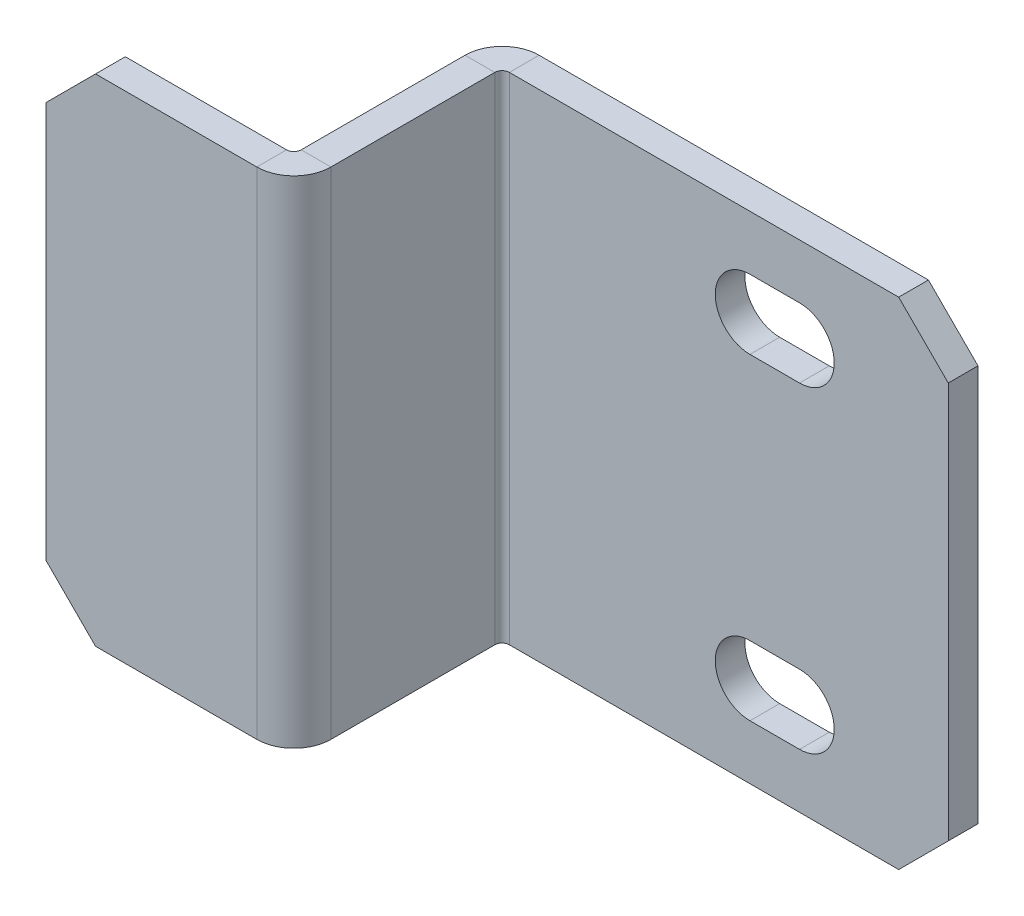
ISO-10303-21;
HEADER;
FILE_DESCRIPTION(('STEP AP214'),'2;1');
FILE_NAME('part.step','',(''),(''),'','','');
FILE_SCHEMA(('AUTOMOTIVE_DESIGN { 1 0 10303 214 1 1 1 1 }'));
ENDSEC;
DATA;
#1=APPLICATION_CONTEXT('core data for automotive mechanical design processes');
#2=APPLICATION_PROTOCOL_DEFINITION('international standard','automotive_design',2000,#1);
#3=PRODUCT_CONTEXT('',#1,'mechanical');
#4=PRODUCT('Part','Part','',(#3));
#5=PRODUCT_RELATED_PRODUCT_CATEGORY('part','',(#4));
#6=PRODUCT_DEFINITION_FORMATION('','',#4);
#7=PRODUCT_DEFINITION_CONTEXT('part definition',#1,'design');
#8=PRODUCT_DEFINITION('design','',#6,#7);
#9=PRODUCT_DEFINITION_SHAPE('','',#8);
#10=(LENGTH_UNIT() NAMED_UNIT(*) SI_UNIT(.MILLI.,.METRE.));
#11=(NAMED_UNIT(*) PLANE_ANGLE_UNIT() SI_UNIT($,.RADIAN.));
#12=(NAMED_UNIT(*) SI_UNIT($,.STERADIAN.) SOLID_ANGLE_UNIT());
#13=UNCERTAINTY_MEASURE_WITH_UNIT(LENGTH_MEASURE(1.E-05),#10,'distance_accuracy_value','');
#14=(GEOMETRIC_REPRESENTATION_CONTEXT(3) GLOBAL_UNCERTAINTY_ASSIGNED_CONTEXT((#13)) GLOBAL_UNIT_ASSIGNED_CONTEXT((#10,
#11,#12)) REPRESENTATION_CONTEXT('',''));
#15=CARTESIAN_POINT('',(0.,0.,0.));
#16=DIRECTION('',(0.,0.,1.));
#17=DIRECTION('',(1.,0.,0.));
#18=AXIS2_PLACEMENT_3D('',#15,#16,#17);
#19=CARTESIAN_POINT('',(-24.,25.,0.));
#20=DIRECTION('',(0.,-1.,0.));
#21=DIRECTION('',(0.,0.,-1.));
#22=AXIS2_PLACEMENT_3D('',#19,#20,#21);
#23=PLANE('',#22);
#24=DIRECTION('',(1.,0.,0.));
#25=VECTOR('',#24,1.);
#26=CARTESIAN_POINT('',(-24.0000000000001,25.,17.2634));
#27=LINE('',#26,#25);
#28=CARTESIAN_POINT('',(-24.0000000000001,25.,17.2634));
#29=VERTEX_POINT('',#28);
#30=CARTESIAN_POINT('',(-21.0000000000001,25.,17.2634));
#31=VERTEX_POINT('',#30);
#32=EDGE_CURVE('E336',#29,#31,#27,.T.);
#33=ORIENTED_EDGE('',*,*,#32,.T.);
#34=DIRECTION('',(0.,0.,1.));
#35=VECTOR('',#34,1.);
#36=CARTESIAN_POINT('',(-21.,25.,0.));
#37=LINE('',#36,#35);
#38=CARTESIAN_POINT('',(-21.,25.,0.736599999999997));
#39=VERTEX_POINT('',#38);
#40=EDGE_CURVE('E361',#31,#39,#37,.F.);
#41=ORIENTED_EDGE('',*,*,#40,.T.);
#42=DIRECTION('',(1.,0.,0.));
#43=VECTOR('',#42,1.);
#44=CARTESIAN_POINT('',(-24.,25.,0.736599999999986));
#45=LINE('',#44,#43);
#46=CARTESIAN_POINT('',(-24.,25.,0.736599999999987));
#47=VERTEX_POINT('',#46);
#48=EDGE_CURVE('E349',#39,#47,#45,.F.);
#49=ORIENTED_EDGE('',*,*,#48,.T.);
#50=DIRECTION('',(0.,0.,-1.));
#51=VECTOR('',#50,1.);
#52=CARTESIAN_POINT('',(-24.,25.,0.));
#53=LINE('',#52,#51);
#54=EDGE_CURVE('E356',#29,#47,#53,.T.);
#55=ORIENTED_EDGE('',*,*,#54,.F.);
#56=EDGE_LOOP('',(#33,#41,#49,#55));
#57=FACE_BOUND('',#56,.T.);
#58=ADVANCED_FACE('F80',(#57),#23,.F.);
#59=CARTESIAN_POINT('',(-24.0000000000001,-25.,21.));
#60=DIRECTION('',(0.,1.,0.));
#61=DIRECTION('',(0.,0.,1.));
#62=AXIS2_PLACEMENT_3D('',#59,#60,#61);
#63=PLANE('',#62);
#64=DIRECTION('',(1.,0.,0.));
#65=VECTOR('',#64,1.);
#66=CARTESIAN_POINT('',(-24.0000000000001,-25.,17.2634));
#67=LINE('',#66,#65);
#68=CARTESIAN_POINT('',(-24.0000000000001,-25.,17.2634));
#69=VERTEX_POINT('',#68);
#70=CARTESIAN_POINT('',(-21.0000000000001,-25.,17.2634));
#71=VERTEX_POINT('',#70);
#72=EDGE_CURVE('E346',#69,#71,#67,.T.);
#73=ORIENTED_EDGE('',*,*,#72,.F.);
#74=DIRECTION('',(0.,0.,1.));
#75=VECTOR('',#74,1.);
#76=CARTESIAN_POINT('',(-24.,-25.,0.));
#77=LINE('',#76,#75);
#78=CARTESIAN_POINT('',(-24.,-25.,0.736599999999983));
#79=VERTEX_POINT('',#78);
#80=EDGE_CURVE('E352',#79,#69,#77,.T.);
#81=ORIENTED_EDGE('',*,*,#80,.F.);
#82=DIRECTION('',(1.,0.,0.));
#83=VECTOR('',#82,1.);
#84=CARTESIAN_POINT('',(-21.,-25.,0.736599999999993));
#85=LINE('',#84,#83);
#86=CARTESIAN_POINT('',(-21.,-25.,0.736599999999993));
#87=VERTEX_POINT('',#86);
#88=EDGE_CURVE('E366',#87,#79,#85,.F.);
#89=ORIENTED_EDGE('',*,*,#88,.F.);
#90=DIRECTION('',(0.,0.,-1.));
#91=VECTOR('',#90,1.);
#92=CARTESIAN_POINT('',(-21.0000000000001,-25.,21.));
#93=LINE('',#92,#91);
#94=EDGE_CURVE('E358',#87,#71,#93,.F.);
#95=ORIENTED_EDGE('',*,*,#94,.T.);
#96=EDGE_LOOP('',(#73,#81,#89,#95));
#97=FACE_BOUND('',#96,.T.);
#98=ADVANCED_FACE('F512',(#97),#63,.F.);
#99=CARTESIAN_POINT('',(-24.,0.,0.));
#100=DIRECTION('',(1.,0.,0.));
#101=DIRECTION('',(0.,0.,-1.));
#102=AXIS2_PLACEMENT_3D('',#99,#100,#101);
#103=PLANE('',#102);
#104=DIRECTION('',(0.,1.,0.));
#105=VECTOR('',#104,1.);
#106=CARTESIAN_POINT('',(-24.0000000000001,25.,17.2634));
#107=LINE('',#106,#105);
#108=EDGE_CURVE('E342',#29,#69,#107,.F.);
#109=ORIENTED_EDGE('',*,*,#108,.F.);
#110=ORIENTED_EDGE('',*,*,#54,.T.);
#111=DIRECTION('',(0.,-1.,0.));
#112=VECTOR('',#111,1.);
#113=CARTESIAN_POINT('',(-24.,25.,0.736599999999986));
#114=LINE('',#113,#112);
#115=EDGE_CURVE('E363',#79,#47,#114,.F.);
#116=ORIENTED_EDGE('',*,*,#115,.F.);
#117=ORIENTED_EDGE('',*,*,#80,.T.);
#118=EDGE_LOOP('',(#109,#110,#116,#117));
#119=FACE_BOUND('',#118,.T.);
#120=ADVANCED_FACE('F515',(#119),#103,.F.);
#121=CARTESIAN_POINT('',(-21.,0.,0.));
#122=DIRECTION('',(1.,0.,0.));
#123=DIRECTION('',(0.,0.,-1.));
#124=AXIS2_PLACEMENT_3D('',#121,#122,#123);
#125=PLANE('',#124);
#126=ORIENTED_EDGE('',*,*,#40,.F.);
#127=DIRECTION('',(0.,1.,0.));
#128=VECTOR('',#127,1.);
#129=CARTESIAN_POINT('',(-21.0000000000001,25.,17.2634));
#130=LINE('',#129,#128);
#131=EDGE_CURVE('E329',#31,#71,#130,.F.);
#132=ORIENTED_EDGE('',*,*,#131,.T.);
#133=ORIENTED_EDGE('',*,*,#94,.F.);
#134=DIRECTION('',(0.,-1.,0.));
#135=VECTOR('',#134,1.);
#136=CARTESIAN_POINT('',(-21.,25.,0.736599999999997));
#137=LINE('',#136,#135);
#138=EDGE_CURVE('E369',#39,#87,#137,.T.);
#139=ORIENTED_EDGE('',*,*,#138,.F.);
#140=EDGE_LOOP('',(#126,#132,#133,#139));
#141=FACE_BOUND('',#140,.T.);
#142=ADVANCED_FACE('F503',(#141),#125,.T.);
#143=CARTESIAN_POINT('',(24.,-25.,-3.));
#144=DIRECTION('',(0.,-1.,0.));
#145=DIRECTION('',(1.,0.,0.));
#146=AXIS2_PLACEMENT_3D('',#143,#144,#145);
#147=PLANE('',#146);
#148=DIRECTION('',(1.,0.,0.));
#149=VECTOR('',#148,1.);
#150=CARTESIAN_POINT('',(24.,-25.,-3.));
#151=LINE('',#150,#149);
#152=CARTESIAN_POINT('',(-20.2634,-25.,-3.));
#153=VERTEX_POINT('',#152);
#154=CARTESIAN_POINT('',(19.,-25.,-3.));
#155=VERTEX_POINT('',#154);
#156=EDGE_CURVE('E397',#153,#155,#151,.T.);
#157=ORIENTED_EDGE('',*,*,#156,.T.);
#158=DIRECTION('',(0.,0.,1.));
#159=VECTOR('',#158,1.);
#160=CARTESIAN_POINT('',(19.,-25.,-3.));
#161=LINE('',#160,#159);
#162=CARTESIAN_POINT('',(19.,-25.,0.));
#163=VERTEX_POINT('',#162);
#164=EDGE_CURVE('E406',#155,#163,#161,.T.);
#165=ORIENTED_EDGE('',*,*,#164,.T.);
#166=DIRECTION('',(1.,0.,0.));
#167=VECTOR('',#166,1.);
#168=CARTESIAN_POINT('',(24.,-25.,0.));
#169=LINE('',#168,#167);
#170=CARTESIAN_POINT('',(-20.2634,-25.,0.));
#171=VERTEX_POINT('',#170);
#172=EDGE_CURVE('E394',#171,#163,#169,.T.);
#173=ORIENTED_EDGE('',*,*,#172,.F.);
#174=DIRECTION('',(0.,0.,-1.));
#175=VECTOR('',#174,1.);
#176=CARTESIAN_POINT('',(-20.2634,-25.,0.));
#177=LINE('',#176,#175);
#178=EDGE_CURVE('E380',#171,#153,#177,.T.);
#179=ORIENTED_EDGE('',*,*,#178,.T.);
#180=EDGE_LOOP('',(#157,#165,#173,#179));
#181=FACE_BOUND('',#180,.T.);
#182=ADVANCED_FACE('F472',(#181),#147,.T.);
#183=CARTESIAN_POINT('',(0.,0.,-3.));
#184=DIRECTION('',(0.,0.,1.));
#185=DIRECTION('',(1.,0.,0.));
#186=AXIS2_PLACEMENT_3D('',#183,#184,#185);
#187=PLANE('',#186);
#188=DIRECTION('',(-1.,0.,0.));
#189=VECTOR('',#188,1.);
#190=CARTESIAN_POINT('',(9.,12.5,-3.));
#191=LINE('',#190,#189);
#192=CARTESIAN_POINT('',(9.,12.5,-3.));
#193=VERTEX_POINT('',#192);
#194=CARTESIAN_POINT('',(3.99999999999999,12.5,-3.));
#195=VERTEX_POINT('',#194);
#196=EDGE_CURVE('E243',#193,#195,#191,.T.);
#197=ORIENTED_EDGE('',*,*,#196,.F.);
#198=CARTESIAN_POINT('',(9.,16.,-3.));
#199=DIRECTION('',(0.,0.,-1.));
#200=DIRECTION('',(-1.,0.,0.));
#201=AXIS2_PLACEMENT_3D('',#198,#199,#200);
#202=CIRCLE('',#201,3.5);
#203=CARTESIAN_POINT('',(9.,19.5,-3.));
#204=VERTEX_POINT('',#203);
#205=EDGE_CURVE('E96',#204,#193,#202,.T.);
#206=ORIENTED_EDGE('',*,*,#205,.F.);
#207=DIRECTION('',(1.,0.,0.));
#208=VECTOR('',#207,1.);
#209=CARTESIAN_POINT('',(9.,19.5,-3.));
#210=LINE('',#209,#208);
#211=CARTESIAN_POINT('',(4.,19.5,-3.));
#212=VERTEX_POINT('',#211);
#213=EDGE_CURVE('E263',#212,#204,#210,.T.);
#214=ORIENTED_EDGE('',*,*,#213,.F.);
#215=CARTESIAN_POINT('',(3.99999999999999,16.,-3.));
#216=DIRECTION('',(0.,0.,-1.));
#217=DIRECTION('',(-1.,0.,0.));
#218=AXIS2_PLACEMENT_3D('',#215,#216,#217);
#219=CIRCLE('',#218,3.5);
#220=EDGE_CURVE('E251',#195,#212,#219,.T.);
#221=ORIENTED_EDGE('',*,*,#220,.F.);
#222=EDGE_LOOP('',(#197,#206,#214,#221));
#223=FACE_BOUND('',#222,.T.);
#224=DIRECTION('',(-1.,0.,0.));
#225=VECTOR('',#224,1.);
#226=CARTESIAN_POINT('',(9.,-19.5,-3.));
#227=LINE('',#226,#225);
#228=CARTESIAN_POINT('',(9.,-19.5,-3.));
#229=VERTEX_POINT('',#228);
#230=CARTESIAN_POINT('',(3.99999999999999,-19.5,-3.));
#231=VERTEX_POINT('',#230);
#232=EDGE_CURVE('E275',#229,#231,#227,.T.);
#233=ORIENTED_EDGE('',*,*,#232,.F.);
#234=CARTESIAN_POINT('',(9.,-16.,-3.));
#235=DIRECTION('',(0.,0.,-1.));
#236=DIRECTION('',(-1.,0.,0.));
#237=AXIS2_PLACEMENT_3D('',#234,#235,#236);
#238=CIRCLE('',#237,3.5);
#239=CARTESIAN_POINT('',(9.,-12.5,-3.));
#240=VERTEX_POINT('',#239);
#241=EDGE_CURVE('E104',#240,#229,#238,.T.);
#242=ORIENTED_EDGE('',*,*,#241,.F.);
#243=DIRECTION('',(1.,0.,0.));
#244=VECTOR('',#243,1.);
#245=CARTESIAN_POINT('',(9.,-12.5,-3.));
#246=LINE('',#245,#244);
#247=CARTESIAN_POINT('',(4.,-12.5,-3.));
#248=VERTEX_POINT('',#247);
#249=EDGE_CURVE('E280',#248,#240,#246,.T.);
#250=ORIENTED_EDGE('',*,*,#249,.F.);
#251=CARTESIAN_POINT('',(3.99999999999999,-16.,-3.));
#252=DIRECTION('',(0.,0.,-1.));
#253=DIRECTION('',(-1.,0.,0.));
#254=AXIS2_PLACEMENT_3D('',#251,#252,#253);
#255=CIRCLE('',#254,3.5);
#256=EDGE_CURVE('E277',#231,#248,#255,.T.);
#257=ORIENTED_EDGE('',*,*,#256,.F.);
#258=EDGE_LOOP('',(#233,#242,#250,#257));
#259=FACE_BOUND('',#258,.T.);
#260=DIRECTION('',(0.,1.,0.));
#261=VECTOR('',#260,1.);
#262=CARTESIAN_POINT('',(24.,-25.,-3.));
#263=LINE('',#262,#261);
#264=CARTESIAN_POINT('',(24.,-20.,-3.));
#265=VERTEX_POINT('',#264);
#266=CARTESIAN_POINT('',(24.,20.,-3.));
#267=VERTEX_POINT('',#266);
#268=EDGE_CURVE('E400',#265,#267,#263,.T.);
#269=ORIENTED_EDGE('',*,*,#268,.F.);
#270=DIRECTION('',(0.707106781186547,0.707106781186549,0.));
#271=VECTOR('',#270,1.);
#272=CARTESIAN_POINT('',(19.,-25.,-3.));
#273=LINE('',#272,#271);
#274=EDGE_CURVE('E426',#265,#155,#273,.F.);
#275=ORIENTED_EDGE('',*,*,#274,.T.);
#276=ORIENTED_EDGE('',*,*,#156,.F.);
#277=DIRECTION('',(0.,-1.,0.));
#278=VECTOR('',#277,1.);
#279=CARTESIAN_POINT('',(-20.2634,-25.,-3.));
#280=LINE('',#279,#278);
#281=CARTESIAN_POINT('',(-20.2634,25.,-3.));
#282=VERTEX_POINT('',#281);
#283=EDGE_CURVE('E373',#153,#282,#280,.F.);
#284=ORIENTED_EDGE('',*,*,#283,.T.);
#285=DIRECTION('',(-1.,0.,0.));
#286=VECTOR('',#285,1.);
#287=CARTESIAN_POINT('',(24.,25.,-3.));
#288=LINE('',#287,#286);
#289=CARTESIAN_POINT('',(19.,25.,-3.));
#290=VERTEX_POINT('',#289);
#291=EDGE_CURVE('E404',#290,#282,#288,.T.);
#292=ORIENTED_EDGE('',*,*,#291,.F.);
#293=DIRECTION('',(-0.707106781186549,0.707106781186546,0.));
#294=VECTOR('',#293,1.);
#295=CARTESIAN_POINT('',(24.,20.,-3.));
#296=LINE('',#295,#294);
#297=EDGE_CURVE('E424',#290,#267,#296,.F.);
#298=ORIENTED_EDGE('',*,*,#297,.T.);
#299=EDGE_LOOP('',(#269,#275,#276,#284,#292,#298));
#300=FACE_BOUND('',#299,.T.);
#301=ADVANCED_FACE('F260',(#223,#259,#300),#187,.F.);
#302=CARTESIAN_POINT('',(0.,0.,0.));
#303=DIRECTION('',(0.,0.,1.));
#304=DIRECTION('',(1.,0.,0.));
#305=AXIS2_PLACEMENT_3D('',#302,#303,#304);
#306=PLANE('',#305);
#307=CARTESIAN_POINT('',(9.,16.,0.));
#308=DIRECTION('',(0.,0.,1.));
#309=DIRECTION('',(1.,0.,0.));
#310=AXIS2_PLACEMENT_3D('',#307,#308,#309);
#311=CIRCLE('',#310,3.5);
#312=CARTESIAN_POINT('',(9.,12.5,0.));
#313=VERTEX_POINT('',#312);
#314=CARTESIAN_POINT('',(9.,19.5,0.));
#315=VERTEX_POINT('',#314);
#316=EDGE_CURVE('E13',#313,#315,#311,.T.);
#317=ORIENTED_EDGE('',*,*,#316,.F.);
#318=DIRECTION('',(1.,0.,0.));
#319=VECTOR('',#318,1.);
#320=CARTESIAN_POINT('',(0.,12.5,0.));
#321=LINE('',#320,#319);
#322=CARTESIAN_POINT('',(3.99999999999999,12.5,0.));
#323=VERTEX_POINT('',#322);
#324=EDGE_CURVE('E271',#323,#313,#321,.T.);
#325=ORIENTED_EDGE('',*,*,#324,.F.);
#326=CARTESIAN_POINT('',(3.99999999999999,16.,0.));
#327=DIRECTION('',(0.,0.,1.));
#328=DIRECTION('',(1.,0.,0.));
#329=AXIS2_PLACEMENT_3D('',#326,#327,#328);
#330=CIRCLE('',#329,3.5);
#331=CARTESIAN_POINT('',(4.,19.5,0.));
#332=VERTEX_POINT('',#331);
#333=EDGE_CURVE('E89',#332,#323,#330,.T.);
#334=ORIENTED_EDGE('',*,*,#333,.F.);
#335=DIRECTION('',(-1.,0.,0.));
#336=VECTOR('',#335,1.);
#337=CARTESIAN_POINT('',(0.,19.5,0.));
#338=LINE('',#337,#336);
#339=EDGE_CURVE('E294',#315,#332,#338,.T.);
#340=ORIENTED_EDGE('',*,*,#339,.F.);
#341=EDGE_LOOP('',(#317,#325,#334,#340));
#342=FACE_BOUND('',#341,.T.);
#343=CARTESIAN_POINT('',(9.,-16.,0.));
#344=DIRECTION('',(0.,0.,1.));
#345=DIRECTION('',(1.,0.,0.));
#346=AXIS2_PLACEMENT_3D('',#343,#344,#345);
#347=CIRCLE('',#346,3.5);
#348=CARTESIAN_POINT('',(9.,-19.5,0.));
#349=VERTEX_POINT('',#348);
#350=CARTESIAN_POINT('',(9.,-12.5,0.));
#351=VERTEX_POINT('',#350);
#352=EDGE_CURVE('E450',#349,#351,#347,.T.);
#353=ORIENTED_EDGE('',*,*,#352,.F.);
#354=DIRECTION('',(1.,0.,0.));
#355=VECTOR('',#354,1.);
#356=CARTESIAN_POINT('',(0.,-19.5,0.));
#357=LINE('',#356,#355);
#358=CARTESIAN_POINT('',(3.99999999999999,-19.5,0.));
#359=VERTEX_POINT('',#358);
#360=EDGE_CURVE('E296',#359,#349,#357,.T.);
#361=ORIENTED_EDGE('',*,*,#360,.F.);
#362=CARTESIAN_POINT('',(3.99999999999999,-16.,0.));
#363=DIRECTION('',(0.,0.,1.));
#364=DIRECTION('',(1.,0.,0.));
#365=AXIS2_PLACEMENT_3D('',#362,#363,#364);
#366=CIRCLE('',#365,3.5);
#367=CARTESIAN_POINT('',(4.,-12.5,0.));
#368=VERTEX_POINT('',#367);
#369=EDGE_CURVE('E448',#368,#359,#366,.T.);
#370=ORIENTED_EDGE('',*,*,#369,.F.);
#371=DIRECTION('',(-1.,0.,0.));
#372=VECTOR('',#371,1.);
#373=CARTESIAN_POINT('',(0.,-12.5,0.));
#374=LINE('',#373,#372);
#375=EDGE_CURVE('E298',#351,#368,#374,.T.);
#376=ORIENTED_EDGE('',*,*,#375,.F.);
#377=EDGE_LOOP('',(#353,#361,#370,#376));
#378=FACE_BOUND('',#377,.T.);
#379=ORIENTED_EDGE('',*,*,#172,.T.);
#380=DIRECTION('',(-0.707106781186547,-0.707106781186549,0.));
#381=VECTOR('',#380,1.);
#382=CARTESIAN_POINT('',(22.,-22.,0.));
#383=LINE('',#382,#381);
#384=CARTESIAN_POINT('',(24.,-20.,0.));
#385=VERTEX_POINT('',#384);
#386=EDGE_CURVE('E417',#163,#385,#383,.F.);
#387=ORIENTED_EDGE('',*,*,#386,.T.);
#388=DIRECTION('',(0.,1.,0.));
#389=VECTOR('',#388,1.);
#390=CARTESIAN_POINT('',(24.,-25.,0.));
#391=LINE('',#390,#389);
#392=CARTESIAN_POINT('',(24.,20.,0.));
#393=VERTEX_POINT('',#392);
#394=EDGE_CURVE('E409',#385,#393,#391,.T.);
#395=ORIENTED_EDGE('',*,*,#394,.T.);
#396=DIRECTION('',(0.707106781186549,-0.707106781186546,0.));
#397=VECTOR('',#396,1.);
#398=CARTESIAN_POINT('',(21.9999999999999,22.0000000000001,0.));
#399=LINE('',#398,#397);
#400=CARTESIAN_POINT('',(19.,25.,0.));
#401=VERTEX_POINT('',#400);
#402=EDGE_CURVE('E415',#393,#401,#399,.F.);
#403=ORIENTED_EDGE('',*,*,#402,.T.);
#404=DIRECTION('',(-1.,0.,0.));
#405=VECTOR('',#404,1.);
#406=CARTESIAN_POINT('',(24.,25.,0.));
#407=LINE('',#406,#405);
#408=CARTESIAN_POINT('',(-20.2634,25.,0.));
#409=VERTEX_POINT('',#408);
#410=EDGE_CURVE('E401',#401,#409,#407,.T.);
#411=ORIENTED_EDGE('',*,*,#410,.T.);
#412=DIRECTION('',(0.,-1.,0.));
#413=VECTOR('',#412,1.);
#414=CARTESIAN_POINT('',(-20.2634,-25.,0.));
#415=LINE('',#414,#413);
#416=EDGE_CURVE('E386',#171,#409,#415,.F.);
#417=ORIENTED_EDGE('',*,*,#416,.F.);
#418=EDGE_LOOP('',(#379,#387,#395,#403,#411,#417));
#419=FACE_BOUND('',#418,.T.);
#420=ADVANCED_FACE('F461',(#342,#378,#419),#306,.T.);
#421=CARTESIAN_POINT('',(24.,25.,-3.));
#422=DIRECTION('',(0.,1.,0.));
#423=DIRECTION('',(-1.,0.,0.));
#424=AXIS2_PLACEMENT_3D('',#421,#422,#423);
#425=PLANE('',#424);
#426=ORIENTED_EDGE('',*,*,#410,.F.);
#427=DIRECTION('',(0.,0.,-1.));
#428=VECTOR('',#427,1.);
#429=CARTESIAN_POINT('',(19.,25.,-3.));
#430=LINE('',#429,#428);
#431=EDGE_CURVE('E428',#401,#290,#430,.T.);
#432=ORIENTED_EDGE('',*,*,#431,.T.);
#433=ORIENTED_EDGE('',*,*,#291,.T.);
#434=DIRECTION('',(0.,0.,-1.));
#435=VECTOR('',#434,1.);
#436=CARTESIAN_POINT('',(-20.2634,25.,0.));
#437=LINE('',#436,#435);
#438=EDGE_CURVE('E391',#409,#282,#437,.T.);
#439=ORIENTED_EDGE('',*,*,#438,.F.);
#440=EDGE_LOOP('',(#426,#432,#433,#439));
#441=FACE_BOUND('',#440,.T.);
#442=ADVANCED_FACE('F524',(#441),#425,.T.);
#443=CARTESIAN_POINT('',(24.,-25.,-3.));
#444=DIRECTION('',(1.,0.,0.));
#445=DIRECTION('',(0.,0.,-1.));
#446=AXIS2_PLACEMENT_3D('',#443,#444,#445);
#447=PLANE('',#446);
#448=ORIENTED_EDGE('',*,*,#394,.F.);
#449=DIRECTION('',(0.,0.,-1.));
#450=VECTOR('',#449,1.);
#451=CARTESIAN_POINT('',(24.,-20.,-3.));
#452=LINE('',#451,#450);
#453=EDGE_CURVE('E422',#385,#265,#452,.T.);
#454=ORIENTED_EDGE('',*,*,#453,.T.);
#455=ORIENTED_EDGE('',*,*,#268,.T.);
#456=DIRECTION('',(0.,0.,1.));
#457=VECTOR('',#456,1.);
#458=CARTESIAN_POINT('',(24.,20.,-3.));
#459=LINE('',#458,#457);
#460=EDGE_CURVE('E419',#267,#393,#459,.T.);
#461=ORIENTED_EDGE('',*,*,#460,.T.);
#462=EDGE_LOOP('',(#448,#454,#455,#461));
#463=FACE_BOUND('',#462,.T.);
#464=ADVANCED_FACE('F523',(#463),#447,.T.);
#465=CARTESIAN_POINT('',(-20.2634,25.,0.7366));
#466=DIRECTION('',(0.,1.,0.));
#467=DIRECTION('',(0.,0.,1.));
#468=AXIS2_PLACEMENT_3D('',#465,#466,#467);
#469=PLANE('',#468);
#470=ORIENTED_EDGE('',*,*,#48,.F.);
#471=CARTESIAN_POINT('',(-20.2634,25.,0.7366));
#472=DIRECTION('',(0.,-1.,0.));
#473=DIRECTION('',(0.,0.,-1.));
#474=AXIS2_PLACEMENT_3D('',#471,#472,#473);
#475=CIRCLE('',#474,0.7366);
#476=EDGE_CURVE('E383',#409,#39,#475,.F.);
#477=ORIENTED_EDGE('',*,*,#476,.F.);
#478=ORIENTED_EDGE('',*,*,#438,.T.);
#479=CARTESIAN_POINT('',(-20.2634,25.,0.7366));
#480=DIRECTION('',(0.,-1.,0.));
#481=DIRECTION('',(0.,0.,-1.));
#482=AXIS2_PLACEMENT_3D('',#479,#480,#481);
#483=CIRCLE('',#482,3.7366);
#484=EDGE_CURVE('E376',#282,#47,#483,.F.);
#485=ORIENTED_EDGE('',*,*,#484,.T.);
#486=EDGE_LOOP('',(#470,#477,#478,#485));
#487=FACE_BOUND('',#486,.T.);
#488=ADVANCED_FACE('F497',(#487),#469,.T.);
#489=CARTESIAN_POINT('',(-20.2634,-25.,0.736599999999996));
#490=DIRECTION('',(0.,1.,0.));
#491=DIRECTION('',(0.,0.,1.));
#492=AXIS2_PLACEMENT_3D('',#489,#490,#491);
#493=PLANE('',#492);
#494=CARTESIAN_POINT('',(-20.2634,-25.,0.736599999999996));
#495=DIRECTION('',(0.,-1.,0.));
#496=DIRECTION('',(0.,0.,-1.));
#497=AXIS2_PLACEMENT_3D('',#494,#495,#496);
#498=CIRCLE('',#497,0.7366);
#499=EDGE_CURVE('E355',#87,#171,#498,.T.);
#500=ORIENTED_EDGE('',*,*,#499,.F.);
#501=ORIENTED_EDGE('',*,*,#88,.T.);
#502=CARTESIAN_POINT('',(-20.2634,-25.,0.736599999999996));
#503=DIRECTION('',(0.,-1.,0.));
#504=DIRECTION('',(0.,0.,-1.));
#505=AXIS2_PLACEMENT_3D('',#502,#503,#504);
#506=CIRCLE('',#505,3.7366);
#507=EDGE_CURVE('E377',#79,#153,#506,.T.);
#508=ORIENTED_EDGE('',*,*,#507,.T.);
#509=ORIENTED_EDGE('',*,*,#178,.F.);
#510=EDGE_LOOP('',(#500,#501,#508,#509));
#511=FACE_BOUND('',#510,.T.);
#512=ADVANCED_FACE('F507',(#511),#493,.F.);
#513=CARTESIAN_POINT('',(-20.2634,-25.,0.736599999999996));
#514=DIRECTION('',(0.,-1.,0.));
#515=DIRECTION('',(-1.,0.,0.));
#516=AXIS2_PLACEMENT_3D('',#513,#514,#515);
#517=CYLINDRICAL_SURFACE('',#516,3.7366);
#518=ORIENTED_EDGE('',*,*,#283,.F.);
#519=ORIENTED_EDGE('',*,*,#507,.F.);
#520=ORIENTED_EDGE('',*,*,#115,.T.);
#521=ORIENTED_EDGE('',*,*,#484,.F.);
#522=EDGE_LOOP('',(#518,#519,#520,#521));
#523=FACE_BOUND('',#522,.T.);
#524=ADVANCED_FACE('F518',(#523),#517,.T.);
#525=CARTESIAN_POINT('',(-20.2634,-25.,0.736599999999996));
#526=DIRECTION('',(0.,-1.,0.));
#527=DIRECTION('',(-1.,0.,0.));
#528=AXIS2_PLACEMENT_3D('',#525,#526,#527);
#529=CYLINDRICAL_SURFACE('',#528,0.7366);
#530=ORIENTED_EDGE('',*,*,#416,.T.);
#531=ORIENTED_EDGE('',*,*,#476,.T.);
#532=ORIENTED_EDGE('',*,*,#138,.T.);
#533=ORIENTED_EDGE('',*,*,#499,.T.);
#534=EDGE_LOOP('',(#530,#531,#532,#533));
#535=FACE_BOUND('',#534,.T.);
#536=ADVANCED_FACE('F492',(#535),#529,.F.);
#537=CARTESIAN_POINT('',(-24.7366000000001,-25.,17.2634));
#538=DIRECTION('',(0.,-1.,0.));
#539=DIRECTION('',(0.,0.,-1.));
#540=AXIS2_PLACEMENT_3D('',#537,#538,#539);
#541=PLANE('',#540);
#542=DIRECTION('',(0.,0.,1.));
#543=VECTOR('',#542,1.);
#544=CARTESIAN_POINT('',(-24.7366000000001,-25.,21.));
#545=LINE('',#544,#543);
#546=CARTESIAN_POINT('',(-24.7366000000001,-25.,18.));
#547=VERTEX_POINT('',#546);
#548=CARTESIAN_POINT('',(-24.7366000000001,-25.,21.));
#549=VERTEX_POINT('',#548);
#550=EDGE_CURVE('E300',#547,#549,#545,.T.);
#551=ORIENTED_EDGE('',*,*,#550,.F.);
#552=CARTESIAN_POINT('',(-24.7366000000001,-25.,17.2634));
#553=DIRECTION('',(0.,1.,0.));
#554=DIRECTION('',(0.,0.,1.));
#555=AXIS2_PLACEMENT_3D('',#552,#553,#554);
#556=CIRCLE('',#555,0.736600000000004);
#557=EDGE_CURVE('E339',#69,#547,#556,.F.);
#558=ORIENTED_EDGE('',*,*,#557,.F.);
#559=ORIENTED_EDGE('',*,*,#72,.T.);
#560=CARTESIAN_POINT('',(-24.7366000000001,-25.,17.2634));
#561=DIRECTION('',(0.,1.,0.));
#562=DIRECTION('',(0.,0.,1.));
#563=AXIS2_PLACEMENT_3D('',#560,#561,#562);
#564=CIRCLE('',#563,3.7366);
#565=EDGE_CURVE('E332',#71,#549,#564,.F.);
#566=ORIENTED_EDGE('',*,*,#565,.T.);
#567=EDGE_LOOP('',(#551,#558,#559,#566));
#568=FACE_BOUND('',#567,.T.);
#569=ADVANCED_FACE('F546',(#568),#541,.T.);
#570=CARTESIAN_POINT('',(-24.7366000000001,25.,17.2634));
#571=DIRECTION('',(0.,-1.,0.));
#572=DIRECTION('',(0.,0.,-1.));
#573=AXIS2_PLACEMENT_3D('',#570,#571,#572);
#574=PLANE('',#573);
#575=CARTESIAN_POINT('',(-24.7366000000001,25.,17.2634));
#576=DIRECTION('',(0.,1.,0.));
#577=DIRECTION('',(0.,0.,1.));
#578=AXIS2_PLACEMENT_3D('',#575,#576,#577);
#579=CIRCLE('',#578,0.736600000000004);
#580=CARTESIAN_POINT('',(-24.7366000000001,25.,18.));
#581=VERTEX_POINT('',#580);
#582=EDGE_CURVE('E303',#581,#29,#579,.T.);
#583=ORIENTED_EDGE('',*,*,#582,.F.);
#584=DIRECTION('',(0.,0.,1.));
#585=VECTOR('',#584,1.);
#586=CARTESIAN_POINT('',(-24.7366000000001,25.,18.));
#587=LINE('',#586,#585);
#588=CARTESIAN_POINT('',(-24.7366000000001,25.,21.));
#589=VERTEX_POINT('',#588);
#590=EDGE_CURVE('E321',#581,#589,#587,.T.);
#591=ORIENTED_EDGE('',*,*,#590,.T.);
#592=CARTESIAN_POINT('',(-24.7366000000001,25.,17.2634));
#593=DIRECTION('',(0.,1.,0.));
#594=DIRECTION('',(0.,0.,1.));
#595=AXIS2_PLACEMENT_3D('',#592,#593,#594);
#596=CIRCLE('',#595,3.7366);
#597=EDGE_CURVE('E333',#589,#31,#596,.T.);
#598=ORIENTED_EDGE('',*,*,#597,.T.);
#599=ORIENTED_EDGE('',*,*,#32,.F.);
#600=EDGE_LOOP('',(#583,#591,#598,#599));
#601=FACE_BOUND('',#600,.T.);
#602=ADVANCED_FACE('F568',(#601),#574,.F.);
#603=CARTESIAN_POINT('',(-24.7366000000001,25.,17.2634));
#604=DIRECTION('',(0.,1.,0.));
#605=DIRECTION('',(0.,0.,1.));
#606=AXIS2_PLACEMENT_3D('',#603,#604,#605);
#607=CYLINDRICAL_SURFACE('',#606,3.7366);
#608=ORIENTED_EDGE('',*,*,#131,.F.);
#609=ORIENTED_EDGE('',*,*,#597,.F.);
#610=DIRECTION('',(0.,1.,0.));
#611=VECTOR('',#610,1.);
#612=CARTESIAN_POINT('',(-24.7366000000001,0.,21.));
#613=LINE('',#612,#611);
#614=EDGE_CURVE('E318',#549,#589,#613,.T.);
#615=ORIENTED_EDGE('',*,*,#614,.F.);
#616=ORIENTED_EDGE('',*,*,#565,.F.);
#617=EDGE_LOOP('',(#608,#609,#615,#616));
#618=FACE_BOUND('',#617,.T.);
#619=ADVANCED_FACE('F577',(#618),#607,.T.);
#620=CARTESIAN_POINT('',(-24.7366000000001,25.,17.2634));
#621=DIRECTION('',(0.,1.,0.));
#622=DIRECTION('',(0.,0.,1.));
#623=AXIS2_PLACEMENT_3D('',#620,#621,#622);
#624=CYLINDRICAL_SURFACE('',#623,0.736600000000004);
#625=ORIENTED_EDGE('',*,*,#108,.T.);
#626=ORIENTED_EDGE('',*,*,#557,.T.);
#627=DIRECTION('',(0.,-1.,0.));
#628=VECTOR('',#627,1.);
#629=CARTESIAN_POINT('',(-24.7366000000001,-25.,18.));
#630=LINE('',#629,#628);
#631=EDGE_CURVE('E324',#547,#581,#630,.F.);
#632=ORIENTED_EDGE('',*,*,#631,.T.);
#633=ORIENTED_EDGE('',*,*,#582,.T.);
#634=EDGE_LOOP('',(#625,#626,#632,#633));
#635=FACE_BOUND('',#634,.T.);
#636=ADVANCED_FACE('F585',(#635),#624,.F.);
#637=CARTESIAN_POINT('',(-24.0000000000001,25.,21.));
#638=DIRECTION('',(0.,1.,0.));
#639=DIRECTION('',(0.,0.,1.));
#640=AXIS2_PLACEMENT_3D('',#637,#638,#639);
#641=PLANE('',#640);
#642=DIRECTION('',(-1.,0.,0.));
#643=VECTOR('',#642,1.);
#644=CARTESIAN_POINT('',(0.,25.,18.));
#645=LINE('',#644,#643);
#646=CARTESIAN_POINT('',(-41.0000000000001,25.,18.));
#647=VERTEX_POINT('',#646);
#648=EDGE_CURVE('E310',#647,#581,#645,.F.);
#649=ORIENTED_EDGE('',*,*,#648,.F.);
#650=DIRECTION('',(0.,0.,1.));
#651=VECTOR('',#650,1.);
#652=CARTESIAN_POINT('',(-41.0000000000001,25.,21.));
#653=LINE('',#652,#651);
#654=CARTESIAN_POINT('',(-41.0000000000001,25.,21.));
#655=VERTEX_POINT('',#654);
#656=EDGE_CURVE('E446',#647,#655,#653,.T.);
#657=ORIENTED_EDGE('',*,*,#656,.T.);
#658=DIRECTION('',(1.,0.,0.));
#659=VECTOR('',#658,1.);
#660=CARTESIAN_POINT('',(-24.0000000000001,25.,21.));
#661=LINE('',#660,#659);
#662=EDGE_CURVE('E301',#655,#589,#661,.T.);
#663=ORIENTED_EDGE('',*,*,#662,.T.);
#664=ORIENTED_EDGE('',*,*,#590,.F.);
#665=EDGE_LOOP('',(#649,#657,#663,#664));
#666=FACE_BOUND('',#665,.T.);
#667=ADVANCED_FACE('F593',(#666),#641,.T.);
#668=CARTESIAN_POINT('',(-46.0000000000001,-25.,21.));
#669=DIRECTION('',(0.,-1.,0.));
#670=DIRECTION('',(1.,0.,0.));
#671=AXIS2_PLACEMENT_3D('',#668,#669,#670);
#672=PLANE('',#671);
#673=DIRECTION('',(-1.,0.,0.));
#674=VECTOR('',#673,1.);
#675=CARTESIAN_POINT('',(-46.0000000000001,-25.,21.));
#676=LINE('',#675,#674);
#677=CARTESIAN_POINT('',(-41.0000000000001,-25.,21.));
#678=VERTEX_POINT('',#677);
#679=EDGE_CURVE('E307',#549,#678,#676,.T.);
#680=ORIENTED_EDGE('',*,*,#679,.T.);
#681=DIRECTION('',(0.,0.,-1.));
#682=VECTOR('',#681,1.);
#683=CARTESIAN_POINT('',(-41.0000000000001,-25.,21.));
#684=LINE('',#683,#682);
#685=CARTESIAN_POINT('',(-41.0000000000001,-25.,18.));
#686=VERTEX_POINT('',#685);
#687=EDGE_CURVE('E430',#678,#686,#684,.T.);
#688=ORIENTED_EDGE('',*,*,#687,.T.);
#689=DIRECTION('',(1.,0.,0.));
#690=VECTOR('',#689,1.);
#691=CARTESIAN_POINT('',(0.,-25.,18.));
#692=LINE('',#691,#690);
#693=EDGE_CURVE('E315',#547,#686,#692,.F.);
#694=ORIENTED_EDGE('',*,*,#693,.F.);
#695=ORIENTED_EDGE('',*,*,#550,.T.);
#696=EDGE_LOOP('',(#680,#688,#694,#695));
#697=FACE_BOUND('',#696,.T.);
#698=ADVANCED_FACE('F602',(#697),#672,.T.);
#699=CARTESIAN_POINT('',(0.,0.,21.));
#700=DIRECTION('',(0.,0.,1.));
#701=DIRECTION('',(1.,0.,0.));
#702=AXIS2_PLACEMENT_3D('',#699,#700,#701);
#703=PLANE('',#702);
#704=DIRECTION('',(0.,1.,0.));
#705=VECTOR('',#704,1.);
#706=CARTESIAN_POINT('',(-46.0000000000001,25.,21.));
#707=LINE('',#706,#705);
#708=CARTESIAN_POINT('',(-46.0000000000001,-20.,21.));
#709=VERTEX_POINT('',#708);
#710=CARTESIAN_POINT('',(-46.0000000000001,20.,21.));
#711=VERTEX_POINT('',#710);
#712=EDGE_CURVE('E304',#709,#711,#707,.T.);
#713=ORIENTED_EDGE('',*,*,#712,.F.);
#714=DIRECTION('',(-0.707106781186546,0.707106781186549,0.));
#715=VECTOR('',#714,1.);
#716=CARTESIAN_POINT('',(-33.0000000000001,-33.,21.));
#717=LINE('',#716,#715);
#718=EDGE_CURVE('E444',#709,#678,#717,.F.);
#719=ORIENTED_EDGE('',*,*,#718,.T.);
#720=ORIENTED_EDGE('',*,*,#679,.F.);
#721=ORIENTED_EDGE('',*,*,#614,.T.);
#722=ORIENTED_EDGE('',*,*,#662,.F.);
#723=DIRECTION('',(0.707106781186549,0.707106781186547,0.));
#724=VECTOR('',#723,1.);
#725=CARTESIAN_POINT('',(-33.,33.0000000000001,21.));
#726=LINE('',#725,#724);
#727=EDGE_CURVE('E442',#655,#711,#726,.F.);
#728=ORIENTED_EDGE('',*,*,#727,.T.);
#729=EDGE_LOOP('',(#713,#719,#720,#721,#722,#728));
#730=FACE_BOUND('',#729,.T.);
#731=ADVANCED_FACE('F611',(#730),#703,.T.);
#732=CARTESIAN_POINT('',(0.,0.,18.));
#733=DIRECTION('',(0.,0.,1.));
#734=DIRECTION('',(1.,0.,0.));
#735=AXIS2_PLACEMENT_3D('',#732,#733,#734);
#736=PLANE('',#735);
#737=ORIENTED_EDGE('',*,*,#693,.T.);
#738=DIRECTION('',(0.707106781186546,-0.707106781186549,0.));
#739=VECTOR('',#738,1.);
#740=CARTESIAN_POINT('',(-41.0000000000001,-25.,18.));
#741=LINE('',#740,#739);
#742=CARTESIAN_POINT('',(-46.0000000000001,-20.,18.));
#743=VERTEX_POINT('',#742);
#744=EDGE_CURVE('E435',#686,#743,#741,.F.);
#745=ORIENTED_EDGE('',*,*,#744,.T.);
#746=DIRECTION('',(0.,-1.,0.));
#747=VECTOR('',#746,1.);
#748=CARTESIAN_POINT('',(-46.0000000000001,0.,18.));
#749=LINE('',#748,#747);
#750=CARTESIAN_POINT('',(-46.0000000000001,20.,18.));
#751=VERTEX_POINT('',#750);
#752=EDGE_CURVE('E312',#743,#751,#749,.F.);
#753=ORIENTED_EDGE('',*,*,#752,.T.);
#754=DIRECTION('',(-0.707106781186549,-0.707106781186547,0.));
#755=VECTOR('',#754,1.);
#756=CARTESIAN_POINT('',(-46.0000000000001,20.,18.));
#757=LINE('',#756,#755);
#758=EDGE_CURVE('E433',#751,#647,#757,.F.);
#759=ORIENTED_EDGE('',*,*,#758,.T.);
#760=ORIENTED_EDGE('',*,*,#648,.T.);
#761=ORIENTED_EDGE('',*,*,#631,.F.);
#762=EDGE_LOOP('',(#737,#745,#753,#759,#760,#761));
#763=FACE_BOUND('',#762,.T.);
#764=ADVANCED_FACE('F619',(#763),#736,.F.);
#765=CARTESIAN_POINT('',(-46.0000000000001,25.,21.));
#766=DIRECTION('',(-1.,0.,0.));
#767=DIRECTION('',(0.,0.,1.));
#768=AXIS2_PLACEMENT_3D('',#765,#766,#767);
#769=PLANE('',#768);
#770=ORIENTED_EDGE('',*,*,#752,.F.);
#771=DIRECTION('',(0.,0.,1.));
#772=VECTOR('',#771,1.);
#773=CARTESIAN_POINT('',(-46.0000000000001,-20.,21.));
#774=LINE('',#773,#772);
#775=EDGE_CURVE('E440',#743,#709,#774,.T.);
#776=ORIENTED_EDGE('',*,*,#775,.T.);
#777=ORIENTED_EDGE('',*,*,#712,.T.);
#778=DIRECTION('',(0.,0.,-1.));
#779=VECTOR('',#778,1.);
#780=CARTESIAN_POINT('',(-46.0000000000001,20.,21.));
#781=LINE('',#780,#779);
#782=EDGE_CURVE('E437',#711,#751,#781,.T.);
#783=ORIENTED_EDGE('',*,*,#782,.T.);
#784=EDGE_LOOP('',(#770,#776,#777,#783));
#785=FACE_BOUND('',#784,.T.);
#786=ADVANCED_FACE('F627',(#785),#769,.T.);
#787=CARTESIAN_POINT('',(19.,-25.,-3.));
#788=DIRECTION('',(-0.707106781186548,0.707106781186546,0.));
#789=DIRECTION('',(0.,0.,1.));
#790=AXIS2_PLACEMENT_3D('',#787,#788,#789);
#791=PLANE('',#790);
#792=ORIENTED_EDGE('',*,*,#274,.F.);
#793=ORIENTED_EDGE('',*,*,#453,.F.);
#794=ORIENTED_EDGE('',*,*,#386,.F.);
#795=ORIENTED_EDGE('',*,*,#164,.F.);
#796=EDGE_LOOP('',(#792,#793,#794,#795));
#797=FACE_BOUND('',#796,.T.);
#798=ADVANCED_FACE('F483',(#797),#791,.F.);
#799=CARTESIAN_POINT('',(24.,20.,-3.));
#800=DIRECTION('',(-0.707106781186546,-0.707106781186549,0.));
#801=DIRECTION('',(0.,0.,1.));
#802=AXIS2_PLACEMENT_3D('',#799,#800,#801);
#803=PLANE('',#802);
#804=ORIENTED_EDGE('',*,*,#297,.F.);
#805=ORIENTED_EDGE('',*,*,#431,.F.);
#806=ORIENTED_EDGE('',*,*,#402,.F.);
#807=ORIENTED_EDGE('',*,*,#460,.F.);
#808=EDGE_LOOP('',(#804,#805,#806,#807));
#809=FACE_BOUND('',#808,.T.);
#810=ADVANCED_FACE('F522',(#809),#803,.F.);
#811=CARTESIAN_POINT('',(-41.0000000000001,-25.,21.));
#812=DIRECTION('',(0.707106781186549,0.707106781186546,0.));
#813=DIRECTION('',(0.,0.,-1.));
#814=AXIS2_PLACEMENT_3D('',#811,#812,#813);
#815=PLANE('',#814);
#816=ORIENTED_EDGE('',*,*,#718,.F.);
#817=ORIENTED_EDGE('',*,*,#775,.F.);
#818=ORIENTED_EDGE('',*,*,#744,.F.);
#819=ORIENTED_EDGE('',*,*,#687,.F.);
#820=EDGE_LOOP('',(#816,#817,#818,#819));
#821=FACE_BOUND('',#820,.T.);
#822=ADVANCED_FACE('F648',(#821),#815,.F.);
#823=CARTESIAN_POINT('',(-46.0000000000001,20.,21.));
#824=DIRECTION('',(0.707106781186546,-0.707106781186548,0.));
#825=DIRECTION('',(0.,0.,-1.));
#826=AXIS2_PLACEMENT_3D('',#823,#824,#825);
#827=PLANE('',#826);
#828=ORIENTED_EDGE('',*,*,#727,.F.);
#829=ORIENTED_EDGE('',*,*,#656,.F.);
#830=ORIENTED_EDGE('',*,*,#758,.F.);
#831=ORIENTED_EDGE('',*,*,#782,.F.);
#832=EDGE_LOOP('',(#828,#829,#830,#831));
#833=FACE_BOUND('',#832,.T.);
#834=ADVANCED_FACE('F83',(#833),#827,.F.);
#835=CARTESIAN_POINT('',(9.,-12.5,7.));
#836=DIRECTION('',(0.,1.,0.));
#837=DIRECTION('',(0.,0.,1.));
#838=AXIS2_PLACEMENT_3D('',#835,#836,#837);
#839=PLANE('',#838);
#840=ORIENTED_EDGE('',*,*,#375,.T.);
#841=DIRECTION('',(0.,0.,-1.));
#842=VECTOR('',#841,1.);
#843=CARTESIAN_POINT('',(4.,-12.5,7.));
#844=LINE('',#843,#842);
#845=EDGE_CURVE('E286',#368,#248,#844,.T.);
#846=ORIENTED_EDGE('',*,*,#845,.T.);
#847=ORIENTED_EDGE('',*,*,#249,.T.);
#848=DIRECTION('',(0.,0.,-1.));
#849=VECTOR('',#848,1.);
#850=CARTESIAN_POINT('',(9.,-12.5,7.));
#851=LINE('',#850,#849);
#852=EDGE_CURVE('E284',#351,#240,#851,.T.);
#853=ORIENTED_EDGE('',*,*,#852,.F.);
#854=EDGE_LOOP('',(#840,#846,#847,#853));
#855=FACE_BOUND('',#854,.T.);
#856=ADVANCED_FACE('F458',(#855),#839,.F.);
#857=CARTESIAN_POINT('',(9.,-19.5,7.));
#858=DIRECTION('',(0.,-1.,0.));
#859=DIRECTION('',(0.,0.,-1.));
#860=AXIS2_PLACEMENT_3D('',#857,#858,#859);
#861=PLANE('',#860);
#862=ORIENTED_EDGE('',*,*,#360,.T.);
#863=DIRECTION('',(0.,0.,-1.));
#864=VECTOR('',#863,1.);
#865=CARTESIAN_POINT('',(9.,-19.5,7.));
#866=LINE('',#865,#864);
#867=EDGE_CURVE('E283',#349,#229,#866,.T.);
#868=ORIENTED_EDGE('',*,*,#867,.T.);
#869=ORIENTED_EDGE('',*,*,#232,.T.);
#870=DIRECTION('',(0.,0.,-1.));
#871=VECTOR('',#870,1.);
#872=CARTESIAN_POINT('',(3.99999999999999,-19.5,7.));
#873=LINE('',#872,#871);
#874=EDGE_CURVE('E289',#359,#231,#873,.T.);
#875=ORIENTED_EDGE('',*,*,#874,.F.);
#876=EDGE_LOOP('',(#862,#868,#869,#875));
#877=FACE_BOUND('',#876,.T.);
#878=ADVANCED_FACE('F468',(#877),#861,.F.);
#879=CARTESIAN_POINT('',(9.,-16.,7.));
#880=DIRECTION('',(0.,0.,-1.));
#881=DIRECTION('',(-1.,0.,0.));
#882=AXIS2_PLACEMENT_3D('',#879,#880,#881);
#883=CYLINDRICAL_SURFACE('',#882,3.5);
#884=ORIENTED_EDGE('',*,*,#352,.T.);
#885=ORIENTED_EDGE('',*,*,#852,.T.);
#886=ORIENTED_EDGE('',*,*,#241,.T.);
#887=ORIENTED_EDGE('',*,*,#867,.F.);
#888=EDGE_LOOP('',(#884,#885,#886,#887));
#889=FACE_BOUND('',#888,.T.);
#890=ADVANCED_FACE('F453',(#889),#883,.F.);
#891=CARTESIAN_POINT('',(3.99999999999999,-16.,7.));
#892=DIRECTION('',(0.,0.,-1.));
#893=DIRECTION('',(-1.,0.,0.));
#894=AXIS2_PLACEMENT_3D('',#891,#892,#893);
#895=CYLINDRICAL_SURFACE('',#894,3.5);
#896=ORIENTED_EDGE('',*,*,#369,.T.);
#897=ORIENTED_EDGE('',*,*,#874,.T.);
#898=ORIENTED_EDGE('',*,*,#256,.T.);
#899=ORIENTED_EDGE('',*,*,#845,.F.);
#900=EDGE_LOOP('',(#896,#897,#898,#899));
#901=FACE_BOUND('',#900,.T.);
#902=ADVANCED_FACE('F465',(#901),#895,.F.);
#903=CARTESIAN_POINT('',(9.,19.5,7.));
#904=DIRECTION('',(0.,1.,0.));
#905=DIRECTION('',(-1.,0.,0.));
#906=AXIS2_PLACEMENT_3D('',#903,#904,#905);
#907=PLANE('',#906);
#908=ORIENTED_EDGE('',*,*,#339,.T.);
#909=DIRECTION('',(0.,0.,-1.));
#910=VECTOR('',#909,1.);
#911=CARTESIAN_POINT('',(4.,19.5,7.));
#912=LINE('',#911,#910);
#913=EDGE_CURVE('E258',#332,#212,#912,.T.);
#914=ORIENTED_EDGE('',*,*,#913,.T.);
#915=ORIENTED_EDGE('',*,*,#213,.T.);
#916=DIRECTION('',(0.,0.,-1.));
#917=VECTOR('',#916,1.);
#918=CARTESIAN_POINT('',(9.,19.5,7.));
#919=LINE('',#918,#917);
#920=EDGE_CURVE('E269',#315,#204,#919,.T.);
#921=ORIENTED_EDGE('',*,*,#920,.F.);
#922=EDGE_LOOP('',(#908,#914,#915,#921));
#923=FACE_BOUND('',#922,.T.);
#924=ADVANCED_FACE('F687',(#923),#907,.F.);
#925=CARTESIAN_POINT('',(9.,12.5,7.));
#926=DIRECTION('',(0.,-1.,0.));
#927=DIRECTION('',(1.,0.,0.));
#928=AXIS2_PLACEMENT_3D('',#925,#926,#927);
#929=PLANE('',#928);
#930=ORIENTED_EDGE('',*,*,#324,.T.);
#931=DIRECTION('',(0.,0.,-1.));
#932=VECTOR('',#931,1.);
#933=CARTESIAN_POINT('',(9.,12.5,7.));
#934=LINE('',#933,#932);
#935=EDGE_CURVE('E248',#313,#193,#934,.T.);
#936=ORIENTED_EDGE('',*,*,#935,.T.);
#937=ORIENTED_EDGE('',*,*,#196,.T.);
#938=DIRECTION('',(0.,0.,-1.));
#939=VECTOR('',#938,1.);
#940=CARTESIAN_POINT('',(3.99999999999999,12.5,7.));
#941=LINE('',#940,#939);
#942=EDGE_CURVE('E246',#323,#195,#941,.T.);
#943=ORIENTED_EDGE('',*,*,#942,.F.);
#944=EDGE_LOOP('',(#930,#936,#937,#943));
#945=FACE_BOUND('',#944,.T.);
#946=ADVANCED_FACE('F245',(#945),#929,.F.);
#947=CARTESIAN_POINT('',(9.,16.,7.));
#948=DIRECTION('',(0.,0.,-1.));
#949=DIRECTION('',(-1.,0.,0.));
#950=AXIS2_PLACEMENT_3D('',#947,#948,#949);
#951=CYLINDRICAL_SURFACE('',#950,3.5);
#952=ORIENTED_EDGE('',*,*,#316,.T.);
#953=ORIENTED_EDGE('',*,*,#920,.T.);
#954=ORIENTED_EDGE('',*,*,#205,.T.);
#955=ORIENTED_EDGE('',*,*,#935,.F.);
#956=EDGE_LOOP('',(#952,#953,#954,#955));
#957=FACE_BOUND('',#956,.T.);
#958=ADVANCED_FACE('F701',(#957),#951,.F.);
#959=CARTESIAN_POINT('',(3.99999999999999,16.,7.));
#960=DIRECTION('',(0.,0.,-1.));
#961=DIRECTION('',(-1.,0.,0.));
#962=AXIS2_PLACEMENT_3D('',#959,#960,#961);
#963=CYLINDRICAL_SURFACE('',#962,3.5);
#964=ORIENTED_EDGE('',*,*,#333,.T.);
#965=ORIENTED_EDGE('',*,*,#942,.T.);
#966=ORIENTED_EDGE('',*,*,#220,.T.);
#967=ORIENTED_EDGE('',*,*,#913,.F.);
#968=EDGE_LOOP('',(#964,#965,#966,#967));
#969=FACE_BOUND('',#968,.T.);
#970=ADVANCED_FACE('F255',(#969),#963,.F.);
#971=CLOSED_SHELL('',(#58,#98,#120,#142,#182,#301,#420,#442,#464,#488,#512,#524,#536,#569,#602,
#619,#636,#667,#698,#731,#764,#786,#798,#810,#822,#834,#856,#878,#890,#902,#924,#946,#958,#970));
#972=MANIFOLD_SOLID_BREP('B2',#971);
#973=ADVANCED_BREP_SHAPE_REPRESENTATION('',(#18,#972),#14);
#974=SHAPE_DEFINITION_REPRESENTATION(#9,#973);
ENDSEC;
END-ISO-10303-21;
